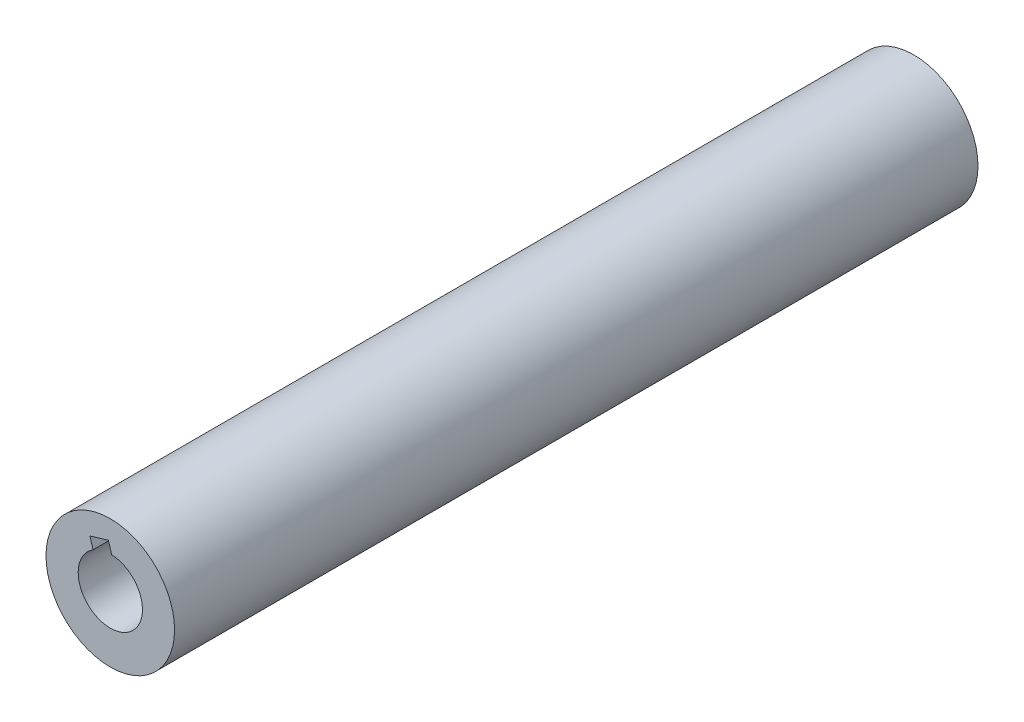
ISO-10303-21;
HEADER;
FILE_DESCRIPTION(('STEP AP214'),'2;1');
FILE_NAME('part.step','',(''),(''),'','','');
FILE_SCHEMA(('AUTOMOTIVE_DESIGN { 1 0 10303 214 1 1 1 1 }'));
ENDSEC;
DATA;
#1=APPLICATION_CONTEXT('core data for automotive mechanical design processes');
#2=APPLICATION_PROTOCOL_DEFINITION('international standard','automotive_design',2000,#1);
#3=PRODUCT_CONTEXT('',#1,'mechanical');
#4=PRODUCT('Part','Part','',(#3));
#5=PRODUCT_RELATED_PRODUCT_CATEGORY('part','',(#4));
#6=PRODUCT_DEFINITION_FORMATION('','',#4);
#7=PRODUCT_DEFINITION_CONTEXT('part definition',#1,'design');
#8=PRODUCT_DEFINITION('design','',#6,#7);
#9=PRODUCT_DEFINITION_SHAPE('','',#8);
#10=(LENGTH_UNIT() NAMED_UNIT(*) SI_UNIT(.MILLI.,.METRE.));
#11=(NAMED_UNIT(*) PLANE_ANGLE_UNIT() SI_UNIT($,.RADIAN.));
#12=(NAMED_UNIT(*) SI_UNIT($,.STERADIAN.) SOLID_ANGLE_UNIT());
#13=UNCERTAINTY_MEASURE_WITH_UNIT(LENGTH_MEASURE(1.E-05),#10,'distance_accuracy_value','');
#14=(GEOMETRIC_REPRESENTATION_CONTEXT(3) GLOBAL_UNCERTAINTY_ASSIGNED_CONTEXT((#13)) GLOBAL_UNIT_ASSIGNED_CONTEXT((#10,
#11,#12)) REPRESENTATION_CONTEXT('',''));
#15=CARTESIAN_POINT('',(0.,0.,0.));
#16=DIRECTION('',(0.,0.,1.));
#17=DIRECTION('',(1.,0.,0.));
#18=AXIS2_PLACEMENT_3D('',#15,#16,#17);
#19=CARTESIAN_POINT('',(-0.0157412534952412,-0.499752151509524,-25.));
#20=DIRECTION('',(0.,0.,-1.));
#21=DIRECTION('',(-1.,0.,0.));
#22=AXIS2_PLACEMENT_3D('',#19,#20,#21);
#23=PLANE('',#22);
#24=CARTESIAN_POINT('',(-0.0157412534952412,-0.499752151509524,-25.));
#25=DIRECTION('',(0.,0.,-1.));
#26=DIRECTION('',(-1.,0.,0.));
#27=AXIS2_PLACEMENT_3D('',#24,#25,#26);
#28=CIRCLE('',#27,20.);
#29=CARTESIAN_POINT('',(-20.0157412534952,-0.499752151509524,-24.9999999999999));
#30=VERTEX_POINT('',#29);
#31=EDGE_CURVE('E41',#30,#30,#28,.T.);
#32=ORIENTED_EDGE('',*,*,#31,.F.);
#33=EDGE_LOOP('',(#32));
#34=FACE_BOUND('',#33,.T.);
#35=DIRECTION('',(-0.289390480640982,0.957211131211073,0.));
#36=VECTOR('',#35,1.);
#37=CARTESIAN_POINT('',(4.76489439273293,-25.1022746497865,-25.));
#38=LINE('',#37,#36);
#39=CARTESIAN_POINT('',(-5.37383024566116,8.43338298020536,-25.));
#40=VERTEX_POINT('',#39);
#41=CARTESIAN_POINT('',(-6.34975236097908,11.6614211309706,-25.));
#42=VERTEX_POINT('',#41);
#43=EDGE_CURVE('E80',#40,#42,#38,.T.);
#44=ORIENTED_EDGE('',*,*,#43,.T.);
#45=DIRECTION('',(-0.957211131211072,-0.289390480640982,0.));
#46=VECTOR('',#45,1.);
#47=CARTESIAN_POINT('',(-6.34975236097908,11.6614211309706,-25.));
#48=LINE('',#47,#46);
#49=CARTESIAN_POINT('',(-0.606485573712648,13.3977640148165,-25.));
#50=VERTEX_POINT('',#49);
#51=EDGE_CURVE('E99',#50,#42,#48,.T.);
#52=ORIENTED_EDGE('',*,*,#51,.F.);
#53=DIRECTION('',(-0.289390480640982,0.957211131211073,0.));
#54=VECTOR('',#53,1.);
#55=CARTESIAN_POINT('',(10.5081611799994,-23.3659317659406,-25.));
#56=LINE('',#55,#54);
#57=CARTESIAN_POINT('',(0.423461068163165,9.9910300131543,-25.));
#58=VERTEX_POINT('',#57);
#59=EDGE_CURVE('E103',#58,#50,#56,.T.);
#60=ORIENTED_EDGE('',*,*,#59,.F.);
#61=CARTESIAN_POINT('',(0.,0.,-25.));
#62=DIRECTION('',(0.,0.,-1.));
#63=DIRECTION('',(-1.,0.,0.));
#64=AXIS2_PLACEMENT_3D('',#61,#62,#63);
#65=CIRCLE('',#64,10.);
#66=EDGE_CURVE('E85',#58,#40,#65,.T.);
#67=ORIENTED_EDGE('',*,*,#66,.T.);
#68=EDGE_LOOP('',(#44,#52,#60,#67));
#69=FACE_BOUND('',#68,.T.);
#70=ADVANCED_FACE('F33',(#34,#69),#23,.F.);
#71=CARTESIAN_POINT('',(0.,0.,-331.568542494924));
#72=DIRECTION('',(0.,0.,1.));
#73=DIRECTION('',(1.,0.,0.));
#74=AXIS2_PLACEMENT_3D('',#71,#72,#73);
#75=CYLINDRICAL_SURFACE('',#74,10.);
#76=CARTESIAN_POINT('',(0.,0.,-275.));
#77=DIRECTION('',(0.,0.,1.));
#78=DIRECTION('',(1.,0.,0.));
#79=AXIS2_PLACEMENT_3D('',#76,#77,#78);
#80=CIRCLE('',#79,10.);
#81=CARTESIAN_POINT('',(-5.37383024566116,8.43338298020536,-275.));
#82=VERTEX_POINT('',#81);
#83=CARTESIAN_POINT('',(0.423461068163166,9.9910300131543,-275.));
#84=VERTEX_POINT('',#83);
#85=EDGE_CURVE('E11',#82,#84,#80,.T.);
#86=ORIENTED_EDGE('',*,*,#85,.F.);
#87=DIRECTION('',(0.,0.,1.));
#88=VECTOR('',#87,1.);
#89=CARTESIAN_POINT('',(-5.37383024566116,8.43338298020536,-331.568542494924));
#90=LINE('',#89,#88);
#91=EDGE_CURVE('E74',#40,#82,#90,.F.);
#92=ORIENTED_EDGE('',*,*,#91,.F.);
#93=ORIENTED_EDGE('',*,*,#66,.F.);
#94=DIRECTION('',(0.,0.,1.));
#95=VECTOR('',#94,1.);
#96=CARTESIAN_POINT('',(0.423461068163165,9.9910300131543,-331.568542494924));
#97=LINE('',#96,#95);
#98=EDGE_CURVE('E91',#84,#58,#97,.T.);
#99=ORIENTED_EDGE('',*,*,#98,.F.);
#100=EDGE_LOOP('',(#86,#92,#93,#99));
#101=FACE_BOUND('',#100,.T.);
#102=ADVANCED_FACE('F90',(#101),#75,.F.);
#103=CARTESIAN_POINT('',(-8.61490018090054,-2.60451432576864,-275.));
#104=DIRECTION('',(0.,0.,1.));
#105=DIRECTION('',(-0.289390480640955,0.957211131211081,0.));
#106=AXIS2_PLACEMENT_3D('',#103,#104,#105);
#107=PLANE('',#106);
#108=CARTESIAN_POINT('',(-0.0157412534952412,-0.499752151509524,-275.));
#109=DIRECTION('',(0.,0.,1.));
#110=DIRECTION('',(1.,0.,0.));
#111=AXIS2_PLACEMENT_3D('',#108,#109,#110);
#112=CIRCLE('',#111,20.);
#113=CARTESIAN_POINT('',(19.9842587465048,-0.499752151509524,-275.));
#114=VERTEX_POINT('',#113);
#115=EDGE_CURVE('E108',#114,#114,#112,.T.);
#116=ORIENTED_EDGE('',*,*,#115,.F.);
#117=EDGE_LOOP('',(#116));
#118=FACE_BOUND('',#117,.T.);
#119=DIRECTION('',(-0.289390480640982,0.957211131211073,0.));
#120=VECTOR('',#119,1.);
#121=CARTESIAN_POINT('',(4.76489439273293,-25.1022746497865,-275.));
#122=LINE('',#121,#120);
#123=CARTESIAN_POINT('',(-6.34975236097908,11.6614211309706,-275.));
#124=VERTEX_POINT('',#123);
#125=EDGE_CURVE('E77',#82,#124,#122,.T.);
#126=ORIENTED_EDGE('',*,*,#125,.F.);
#127=ORIENTED_EDGE('',*,*,#85,.T.);
#128=DIRECTION('',(-0.289390480640982,0.957211131211073,0.));
#129=VECTOR('',#128,1.);
#130=CARTESIAN_POINT('',(10.5081611799994,-23.3659317659406,-275.));
#131=LINE('',#130,#129);
#132=CARTESIAN_POINT('',(-0.606485573712648,13.3977640148165,-275.));
#133=VERTEX_POINT('',#132);
#134=EDGE_CURVE('E56',#84,#133,#131,.T.);
#135=ORIENTED_EDGE('',*,*,#134,.T.);
#136=DIRECTION('',(0.957211131211072,0.289390480640982,0.));
#137=VECTOR('',#136,1.);
#138=CARTESIAN_POINT('',(-6.34975236097908,11.6614211309706,-275.));
#139=LINE('',#138,#137);
#140=EDGE_CURVE('E88',#124,#133,#139,.T.);
#141=ORIENTED_EDGE('',*,*,#140,.F.);
#142=EDGE_LOOP('',(#126,#127,#135,#141));
#143=FACE_BOUND('',#142,.T.);
#144=ADVANCED_FACE('F35',(#118,#143),#107,.F.);
#145=CARTESIAN_POINT('',(-0.0157412534952412,-0.499752151509524,-331.568542494924));
#146=DIRECTION('',(0.,0.,1.));
#147=DIRECTION('',(1.,0.,0.));
#148=AXIS2_PLACEMENT_3D('',#145,#146,#147);
#149=CYLINDRICAL_SURFACE('',#148,20.);
#150=ORIENTED_EDGE('',*,*,#115,.T.);
#151=EDGE_LOOP('',(#150));
#152=FACE_BOUND('',#151,.T.);
#153=ORIENTED_EDGE('',*,*,#31,.T.);
#154=EDGE_LOOP('',(#153));
#155=FACE_BOUND('',#154,.T.);
#156=ADVANCED_FACE('F112',(#152,#155),#149,.T.);
#157=CARTESIAN_POINT('',(4.76489439273293,-25.1022746497865,-275.));
#158=DIRECTION('',(0.957211131211073,0.289390480640982,0.));
#159=DIRECTION('',(-0.289390480640982,0.957211131211073,0.));
#160=AXIS2_PLACEMENT_3D('',#157,#158,#159);
#161=PLANE('',#160);
#162=ORIENTED_EDGE('',*,*,#91,.T.);
#163=ORIENTED_EDGE('',*,*,#125,.T.);
#164=DIRECTION('',(0.,0.,-1.));
#165=VECTOR('',#164,1.);
#166=CARTESIAN_POINT('',(-6.34975236097908,11.6614211309706,-275.));
#167=LINE('',#166,#165);
#168=EDGE_CURVE('E48',#42,#124,#167,.T.);
#169=ORIENTED_EDGE('',*,*,#168,.F.);
#170=ORIENTED_EDGE('',*,*,#43,.F.);
#171=EDGE_LOOP('',(#162,#163,#169,#170));
#172=FACE_BOUND('',#171,.T.);
#173=ADVANCED_FACE('F76',(#172),#161,.T.);
#174=CARTESIAN_POINT('',(10.5081611799994,-23.3659317659406,-275.));
#175=DIRECTION('',(-0.957211131211073,-0.289390480640982,0.));
#176=DIRECTION('',(0.289390480640982,-0.957211131211073,0.));
#177=AXIS2_PLACEMENT_3D('',#174,#175,#176);
#178=PLANE('',#177);
#179=ORIENTED_EDGE('',*,*,#98,.T.);
#180=ORIENTED_EDGE('',*,*,#59,.T.);
#181=DIRECTION('',(0.,0.,1.));
#182=VECTOR('',#181,1.);
#183=CARTESIAN_POINT('',(-0.606485573712648,13.3977640148165,-275.));
#184=LINE('',#183,#182);
#185=EDGE_CURVE('E94',#133,#50,#184,.T.);
#186=ORIENTED_EDGE('',*,*,#185,.F.);
#187=ORIENTED_EDGE('',*,*,#134,.F.);
#188=EDGE_LOOP('',(#179,#180,#186,#187));
#189=FACE_BOUND('',#188,.T.);
#190=ADVANCED_FACE('F129',(#189),#178,.T.);
#191=CARTESIAN_POINT('',(-3.76207624833277,12.443744705744,0.));
#192=DIRECTION('',(0.289390480640982,-0.957211131211073,0.));
#193=DIRECTION('',(0.957211131211073,0.289390480640982,0.));
#194=AXIS2_PLACEMENT_3D('',#191,#192,#193);
#195=PLANE('',#194);
#196=ORIENTED_EDGE('',*,*,#140,.T.);
#197=ORIENTED_EDGE('',*,*,#185,.T.);
#198=ORIENTED_EDGE('',*,*,#51,.T.);
#199=ORIENTED_EDGE('',*,*,#168,.T.);
#200=EDGE_LOOP('',(#196,#197,#198,#199));
#201=FACE_BOUND('',#200,.T.);
#202=ADVANCED_FACE('F132',(#201),#195,.T.);
#203=CLOSED_SHELL('',(#70,#102,#144,#156,#173,#190,#202));
#204=MANIFOLD_SOLID_BREP('B2',#203);
#205=ADVANCED_BREP_SHAPE_REPRESENTATION('',(#18,#204),#14);
#206=SHAPE_DEFINITION_REPRESENTATION(#9,#205);
ENDSEC;
END-ISO-10303-21;
